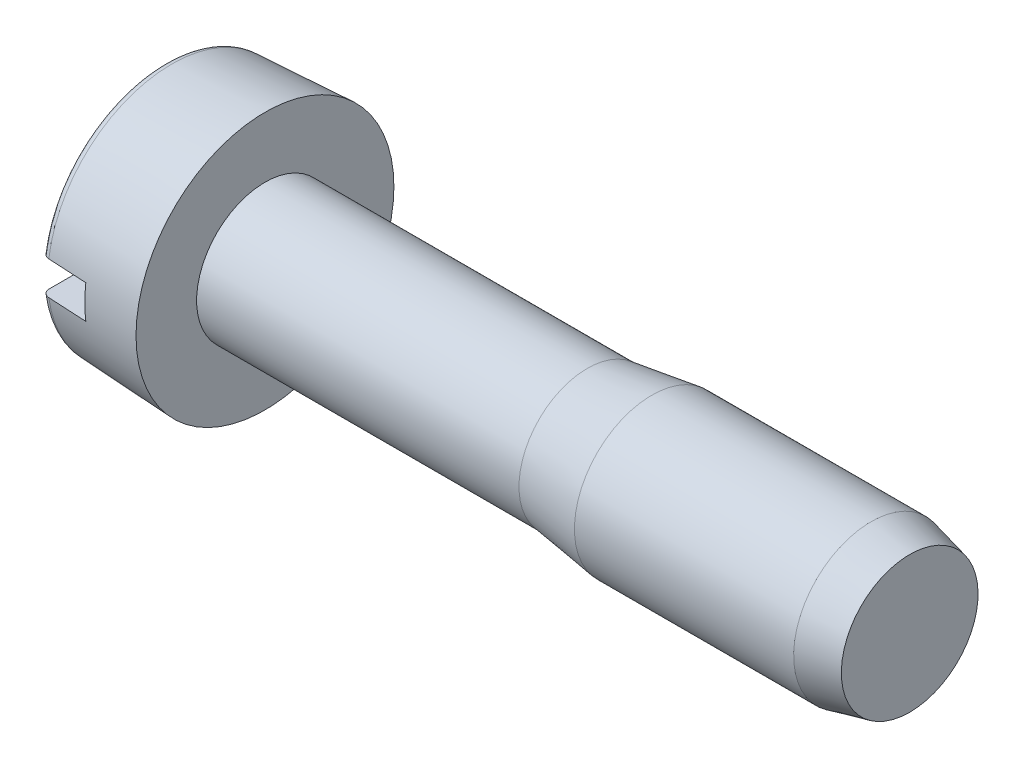
ISO-10303-21;
HEADER;
FILE_DESCRIPTION(('STEP AP214'),'2;1');
FILE_NAME('part.step','',(''),(''),'','','');
FILE_SCHEMA(('AUTOMOTIVE_DESIGN { 1 0 10303 214 1 1 1 1 }'));
ENDSEC;
DATA;
#1=APPLICATION_CONTEXT('core data for automotive mechanical design processes');
#2=APPLICATION_PROTOCOL_DEFINITION('international standard','automotive_design',2000,#1);
#3=PRODUCT_CONTEXT('',#1,'mechanical');
#4=PRODUCT('Part','Part','',(#3));
#5=PRODUCT_RELATED_PRODUCT_CATEGORY('part','',(#4));
#6=PRODUCT_DEFINITION_FORMATION('','',#4);
#7=PRODUCT_DEFINITION_CONTEXT('part definition',#1,'design');
#8=PRODUCT_DEFINITION('design','',#6,#7);
#9=PRODUCT_DEFINITION_SHAPE('','',#8);
#10=(LENGTH_UNIT() NAMED_UNIT(*) SI_UNIT(.MILLI.,.METRE.));
#11=(NAMED_UNIT(*) PLANE_ANGLE_UNIT() SI_UNIT($,.RADIAN.));
#12=(NAMED_UNIT(*) SI_UNIT($,.STERADIAN.) SOLID_ANGLE_UNIT());
#13=UNCERTAINTY_MEASURE_WITH_UNIT(LENGTH_MEASURE(1.E-05),#10,'distance_accuracy_value','');
#14=(GEOMETRIC_REPRESENTATION_CONTEXT(3) GLOBAL_UNCERTAINTY_ASSIGNED_CONTEXT((#13)) GLOBAL_UNIT_ASSIGNED_CONTEXT((#10,
#11,#12)) REPRESENTATION_CONTEXT('',''));
#15=CARTESIAN_POINT('',(0.,0.,0.));
#16=DIRECTION('',(0.,0.,1.));
#17=DIRECTION('',(1.,0.,0.));
#18=AXIS2_PLACEMENT_3D('',#15,#16,#17);
#19=CARTESIAN_POINT('',(-27.1,-3.1,0.6));
#20=DIRECTION('',(0.,1.,0.));
#21=DIRECTION('',(0.,0.,1.));
#22=AXIS2_PLACEMENT_3D('',#19,#20,#21);
#23=PLANE('',#22);
#24=DIRECTION('',(0.,0.,-1.));
#25=VECTOR('',#24,1.);
#26=CARTESIAN_POINT('',(-27.1,-3.1,-0.821756947872713));
#27=LINE('',#26,#25);
#28=CARTESIAN_POINT('',(-27.1,-3.1,0.6));
#29=VERTEX_POINT('',#28);
#30=CARTESIAN_POINT('',(-27.1,-3.1,-0.6));
#31=VERTEX_POINT('',#30);
#32=EDGE_CURVE('E168',#29,#31,#27,.T.);
#33=ORIENTED_EDGE('',*,*,#32,.T.);
#34=DIRECTION('',(1.,0.,0.));
#35=VECTOR('',#34,1.);
#36=CARTESIAN_POINT('',(-27.1,-3.1,-0.6));
#37=LINE('',#36,#35);
#38=CARTESIAN_POINT('',(-28.9,-3.1,-0.6));
#39=VERTEX_POINT('',#38);
#40=EDGE_CURVE('E167',#39,#31,#37,.T.);
#41=ORIENTED_EDGE('',*,*,#40,.F.);
#42=DIRECTION('',(0.,0.,1.));
#43=VECTOR('',#42,1.);
#44=CARTESIAN_POINT('',(-28.9,-3.1,0.6));
#45=LINE('',#44,#43);
#46=CARTESIAN_POINT('',(-28.9,-3.1,0.6));
#47=VERTEX_POINT('',#46);
#48=EDGE_CURVE('E177',#39,#47,#45,.T.);
#49=ORIENTED_EDGE('',*,*,#48,.T.);
#50=DIRECTION('',(1.,0.,0.));
#51=VECTOR('',#50,1.);
#52=CARTESIAN_POINT('',(-27.1,-3.1,0.6));
#53=LINE('',#52,#51);
#54=EDGE_CURVE('E207',#29,#47,#53,.F.);
#55=ORIENTED_EDGE('',*,*,#54,.F.);
#56=EDGE_LOOP('',(#33,#41,#49,#55));
#57=FACE_BOUND('',#56,.T.);
#58=ADVANCED_FACE('F17',(#57),#23,.T.);
#59=CARTESIAN_POINT('',(-27.1,-0.6,3.1));
#60=DIRECTION('',(0.,0.998329605681856,-0.0577754136212761));
#61=DIRECTION('',(0.,0.0577754136212761,0.998329605681856));
#62=AXIS2_PLACEMENT_3D('',#59,#60,#61);
#63=PLANE('',#62);
#64=DIRECTION('',(0.,-0.0577754136212742,-0.998329605681856));
#65=VECTOR('',#64,1.);
#66=CARTESIAN_POINT('',(-27.1,-0.65,2.23602556597347));
#67=LINE('',#66,#65);
#68=CARTESIAN_POINT('',(-27.1,-0.649999999999998,2.23602556597351));
#69=VERTEX_POINT('',#68);
#70=CARTESIAN_POINT('',(-27.1,-0.736765313499312,0.736765313499308));
#71=VERTEX_POINT('',#70);
#72=EDGE_CURVE('E186',#69,#71,#67,.T.);
#73=ORIENTED_EDGE('',*,*,#72,.T.);
#74=DIRECTION('',(1.,0.,0.));
#75=VECTOR('',#74,1.);
#76=CARTESIAN_POINT('',(-27.1,-0.736765313499312,0.736765313499308));
#77=LINE('',#76,#75);
#78=CARTESIAN_POINT('',(-28.9,-0.736765313499312,0.736765313499308));
#79=VERTEX_POINT('',#78);
#80=EDGE_CURVE('E196',#79,#71,#77,.T.);
#81=ORIENTED_EDGE('',*,*,#80,.F.);
#82=DIRECTION('',(0.,0.0577754136212761,0.998329605681856));
#83=VECTOR('',#82,1.);
#84=CARTESIAN_POINT('',(-28.9,-0.6,3.1));
#85=LINE('',#84,#83);
#86=CARTESIAN_POINT('',(-28.9,-0.65,2.23602556597344));
#87=VERTEX_POINT('',#86);
#88=EDGE_CURVE('E173',#79,#87,#85,.T.);
#89=ORIENTED_EDGE('',*,*,#88,.T.);
#90=DIRECTION('',(1.,0.,0.));
#91=VECTOR('',#90,1.);
#92=CARTESIAN_POINT('',(-27.1,-0.65,2.23602556597347));
#93=LINE('',#92,#91);
#94=EDGE_CURVE('E137',#69,#87,#93,.F.);
#95=ORIENTED_EDGE('',*,*,#94,.F.);
#96=EDGE_LOOP('',(#73,#81,#89,#95));
#97=FACE_BOUND('',#96,.T.);
#98=ADVANCED_FACE('F457',(#97),#63,.T.);
#99=CARTESIAN_POINT('',(-27.1,-0.6,-3.1));
#100=DIRECTION('',(0.,0.998329605681856,0.0577754136212757));
#101=DIRECTION('',(0.,-0.0577754136212757,0.998329605681856));
#102=AXIS2_PLACEMENT_3D('',#99,#100,#101);
#103=PLANE('',#102);
#104=DIRECTION('',(0.,-0.0577754136212757,0.998329605681856));
#105=VECTOR('',#104,1.);
#106=CARTESIAN_POINT('',(-28.9,-0.6,-3.1));
#107=LINE('',#106,#105);
#108=CARTESIAN_POINT('',(-28.9,-0.649999999999999,-2.23602556597346));
#109=VERTEX_POINT('',#108);
#110=CARTESIAN_POINT('',(-28.9,-0.736765313499312,-0.736765313499307));
#111=VERTEX_POINT('',#110);
#112=EDGE_CURVE('E171',#109,#111,#107,.T.);
#113=ORIENTED_EDGE('',*,*,#112,.T.);
#114=DIRECTION('',(1.,0.,0.));
#115=VECTOR('',#114,1.);
#116=CARTESIAN_POINT('',(-27.1,-0.736765313499312,-0.736765313499306));
#117=LINE('',#116,#115);
#118=CARTESIAN_POINT('',(-27.1,-0.736765313499312,-0.736765313499307));
#119=VERTEX_POINT('',#118);
#120=EDGE_CURVE('E193',#119,#111,#117,.F.);
#121=ORIENTED_EDGE('',*,*,#120,.F.);
#122=DIRECTION('',(0.,0.0577754136212742,-0.998329605681856));
#123=VECTOR('',#122,1.);
#124=CARTESIAN_POINT('',(-27.1,-0.736765313499312,-0.736765313499307));
#125=LINE('',#124,#123);
#126=CARTESIAN_POINT('',(-27.1,-0.65,-2.23602556597346));
#127=VERTEX_POINT('',#126);
#128=EDGE_CURVE('E165',#119,#127,#125,.T.);
#129=ORIENTED_EDGE('',*,*,#128,.T.);
#130=DIRECTION('',(1.,0.,0.));
#131=VECTOR('',#130,1.);
#132=CARTESIAN_POINT('',(-27.1,-0.649999999999999,-2.23602556597346));
#133=LINE('',#132,#131);
#134=EDGE_CURVE('E152',#109,#127,#133,.T.);
#135=ORIENTED_EDGE('',*,*,#134,.F.);
#136=EDGE_LOOP('',(#113,#121,#129,#135));
#137=FACE_BOUND('',#136,.T.);
#138=ADVANCED_FACE('F588',(#137),#103,.T.);
#139=CARTESIAN_POINT('',(-27.1,3.1,0.6));
#140=DIRECTION('',(0.,-1.,0.));
#141=DIRECTION('',(0.,0.,-1.));
#142=AXIS2_PLACEMENT_3D('',#139,#140,#141);
#143=PLANE('',#142);
#144=DIRECTION('',(0.,0.,-1.));
#145=VECTOR('',#144,1.);
#146=CARTESIAN_POINT('',(-27.1,3.1,-0.821756947872713));
#147=LINE('',#146,#145);
#148=CARTESIAN_POINT('',(-27.1,3.1,-0.6));
#149=VERTEX_POINT('',#148);
#150=CARTESIAN_POINT('',(-27.1,3.1,0.6));
#151=VERTEX_POINT('',#150);
#152=EDGE_CURVE('E390',#149,#151,#147,.F.);
#153=ORIENTED_EDGE('',*,*,#152,.T.);
#154=DIRECTION('',(1.,0.,0.));
#155=VECTOR('',#154,1.);
#156=CARTESIAN_POINT('',(-27.1,3.1,0.6));
#157=LINE('',#156,#155);
#158=CARTESIAN_POINT('',(-28.9,3.1,0.6));
#159=VERTEX_POINT('',#158);
#160=EDGE_CURVE('E153',#159,#151,#157,.T.);
#161=ORIENTED_EDGE('',*,*,#160,.F.);
#162=DIRECTION('',(0.,0.,-1.));
#163=VECTOR('',#162,1.);
#164=CARTESIAN_POINT('',(-28.9,3.1,0.6));
#165=LINE('',#164,#163);
#166=CARTESIAN_POINT('',(-28.9,3.1,-0.6));
#167=VERTEX_POINT('',#166);
#168=EDGE_CURVE('E161',#159,#167,#165,.T.);
#169=ORIENTED_EDGE('',*,*,#168,.T.);
#170=DIRECTION('',(1.,0.,0.));
#171=VECTOR('',#170,1.);
#172=CARTESIAN_POINT('',(-27.1,3.1,-0.6));
#173=LINE('',#172,#171);
#174=EDGE_CURVE('E227',#149,#167,#173,.F.);
#175=ORIENTED_EDGE('',*,*,#174,.F.);
#176=EDGE_LOOP('',(#153,#161,#169,#175));
#177=FACE_BOUND('',#176,.T.);
#178=ADVANCED_FACE('F586',(#177),#143,.T.);
#179=CARTESIAN_POINT('',(-27.1,0.6,-3.1));
#180=DIRECTION('',(0.,-0.998329605681856,0.0577754136212758));
#181=DIRECTION('',(0.,-0.0577754136212758,-0.998329605681856));
#182=AXIS2_PLACEMENT_3D('',#179,#180,#181);
#183=PLANE('',#182);
#184=DIRECTION('',(0.,0.0577754136212756,0.998329605681856));
#185=VECTOR('',#184,1.);
#186=CARTESIAN_POINT('',(-27.1,0.65,-2.23602556597345));
#187=LINE('',#186,#185);
#188=CARTESIAN_POINT('',(-27.1,0.650000000000002,-2.23602556597343));
#189=VERTEX_POINT('',#188);
#190=CARTESIAN_POINT('',(-27.1,0.736765313499313,-0.736765313499307));
#191=VERTEX_POINT('',#190);
#192=EDGE_CURVE('E147',#189,#191,#187,.T.);
#193=ORIENTED_EDGE('',*,*,#192,.T.);
#194=DIRECTION('',(1.,0.,0.));
#195=VECTOR('',#194,1.);
#196=CARTESIAN_POINT('',(-27.1,0.736765313499312,-0.736765313499306));
#197=LINE('',#196,#195);
#198=CARTESIAN_POINT('',(-28.9,0.736765313499312,-0.736765313499307));
#199=VERTEX_POINT('',#198);
#200=EDGE_CURVE('E217',#199,#191,#197,.T.);
#201=ORIENTED_EDGE('',*,*,#200,.F.);
#202=DIRECTION('',(0.,-0.0577754136212758,-0.998329605681856));
#203=VECTOR('',#202,1.);
#204=CARTESIAN_POINT('',(-28.9,0.6,-3.1));
#205=LINE('',#204,#203);
#206=CARTESIAN_POINT('',(-28.9,0.650000000000001,-2.23602556597343));
#207=VERTEX_POINT('',#206);
#208=EDGE_CURVE('E402',#199,#207,#205,.T.);
#209=ORIENTED_EDGE('',*,*,#208,.T.);
#210=DIRECTION('',(1.,0.,0.));
#211=VECTOR('',#210,1.);
#212=CARTESIAN_POINT('',(-27.1,0.650000000000001,-2.23602556597345));
#213=LINE('',#212,#211);
#214=EDGE_CURVE('E370',#189,#207,#213,.F.);
#215=ORIENTED_EDGE('',*,*,#214,.F.);
#216=EDGE_LOOP('',(#193,#201,#209,#215));
#217=FACE_BOUND('',#216,.T.);
#218=ADVANCED_FACE('F417',(#217),#183,.T.);
#219=CARTESIAN_POINT('',(-27.1,0.6,3.1));
#220=DIRECTION('',(0.,-0.998329605681856,-0.0577754136212763));
#221=DIRECTION('',(0.,0.0577754136212763,-0.998329605681856));
#222=AXIS2_PLACEMENT_3D('',#219,#220,#221);
#223=PLANE('',#222);
#224=DIRECTION('',(0.,0.0577754136212763,-0.998329605681856));
#225=VECTOR('',#224,1.);
#226=CARTESIAN_POINT('',(-28.9,0.6,3.1));
#227=LINE('',#226,#225);
#228=CARTESIAN_POINT('',(-28.9,0.650000000000001,2.23602556597341));
#229=VERTEX_POINT('',#228);
#230=CARTESIAN_POINT('',(-28.9,0.736765313499313,0.736765313499306));
#231=VERTEX_POINT('',#230);
#232=EDGE_CURVE('E148',#229,#231,#227,.T.);
#233=ORIENTED_EDGE('',*,*,#232,.T.);
#234=DIRECTION('',(1.,0.,0.));
#235=VECTOR('',#234,1.);
#236=CARTESIAN_POINT('',(-27.1,0.736765313499312,0.736765313499306));
#237=LINE('',#236,#235);
#238=CARTESIAN_POINT('',(-27.1,0.736765313499313,0.736765313499307));
#239=VERTEX_POINT('',#238);
#240=EDGE_CURVE('E214',#239,#231,#237,.F.);
#241=ORIENTED_EDGE('',*,*,#240,.F.);
#242=DIRECTION('',(0.,-0.0577754136212775,0.998329605681856));
#243=VECTOR('',#242,1.);
#244=CARTESIAN_POINT('',(-27.1,0.736765313499313,0.736765313499307));
#245=LINE('',#244,#243);
#246=CARTESIAN_POINT('',(-27.1,0.65,2.23602556597342));
#247=VERTEX_POINT('',#246);
#248=EDGE_CURVE('E393',#239,#247,#245,.T.);
#249=ORIENTED_EDGE('',*,*,#248,.T.);
#250=DIRECTION('',(1.,0.,0.));
#251=VECTOR('',#250,1.);
#252=CARTESIAN_POINT('',(-27.1,0.65,2.23602556597342));
#253=LINE('',#252,#251);
#254=EDGE_CURVE('E271',#229,#247,#253,.T.);
#255=ORIENTED_EDGE('',*,*,#254,.F.);
#256=EDGE_LOOP('',(#233,#241,#249,#255));
#257=FACE_BOUND('',#256,.T.);
#258=ADVANCED_FACE('F585',(#257),#223,.T.);
#259=CARTESIAN_POINT('',(-27.1,0.731846670595882,-0.821756947872713));
#260=DIRECTION('',(1.,0.,0.));
#261=DIRECTION('',(0.,0.,-1.));
#262=AXIS2_PLACEMENT_3D('',#259,#260,#261);
#263=PLANE('',#262);
#264=ORIENTED_EDGE('',*,*,#128,.F.);
#265=DIRECTION('',(0.,-0.998329605681856,0.0577754136212735));
#266=VECTOR('',#265,1.);
#267=CARTESIAN_POINT('',(-27.1,-3.1,-0.6));
#268=LINE('',#267,#266);
#269=EDGE_CURVE('E197',#31,#119,#268,.F.);
#270=ORIENTED_EDGE('',*,*,#269,.F.);
#271=ORIENTED_EDGE('',*,*,#32,.F.);
#272=DIRECTION('',(0.,0.998329605681856,0.0577754136212742));
#273=VECTOR('',#272,1.);
#274=CARTESIAN_POINT('',(-27.1,-3.1,0.6));
#275=LINE('',#274,#273);
#276=EDGE_CURVE('E204',#71,#29,#275,.F.);
#277=ORIENTED_EDGE('',*,*,#276,.F.);
#278=ORIENTED_EDGE('',*,*,#72,.F.);
#279=DIRECTION('',(0.,0.,1.));
#280=VECTOR('',#279,1.);
#281=CARTESIAN_POINT('',(-27.1,-0.65,6.));
#282=LINE('',#281,#280);
#283=CARTESIAN_POINT('',(-27.1000000000093,-0.65,4.84655021971619));
#284=VERTEX_POINT('',#283);
#285=EDGE_CURVE('E180',#284,#69,#282,.F.);
#286=ORIENTED_EDGE('',*,*,#285,.F.);
#287=CARTESIAN_POINT('',(-27.1000000000186,0.,0.));
#288=DIRECTION('',(1.,0.,0.));
#289=DIRECTION('',(0.,0.,-1.));
#290=AXIS2_PLACEMENT_3D('',#287,#288,#289);
#291=CIRCLE('',#290,4.8899436635023);
#292=CARTESIAN_POINT('',(-27.1000000000111,0.65,4.84655021971609));
#293=VERTEX_POINT('',#292);
#294=EDGE_CURVE('E188',#293,#284,#291,.T.);
#295=ORIENTED_EDGE('',*,*,#294,.F.);
#296=DIRECTION('',(0.,0.,-1.));
#297=VECTOR('',#296,1.);
#298=CARTESIAN_POINT('',(-27.1,0.65,6.));
#299=LINE('',#298,#297);
#300=EDGE_CURVE('E250',#247,#293,#299,.F.);
#301=ORIENTED_EDGE('',*,*,#300,.F.);
#302=ORIENTED_EDGE('',*,*,#248,.F.);
#303=DIRECTION('',(0.,0.998329605681856,-0.0577754136212734));
#304=VECTOR('',#303,1.);
#305=CARTESIAN_POINT('',(-27.1,3.1,0.6));
#306=LINE('',#305,#304);
#307=EDGE_CURVE('E156',#151,#239,#306,.F.);
#308=ORIENTED_EDGE('',*,*,#307,.F.);
#309=ORIENTED_EDGE('',*,*,#152,.F.);
#310=DIRECTION('',(0.,-0.998329605681856,-0.0577754136212735));
#311=VECTOR('',#310,1.);
#312=CARTESIAN_POINT('',(-27.1,3.1,-0.6));
#313=LINE('',#312,#311);
#314=EDGE_CURVE('E224',#191,#149,#313,.F.);
#315=ORIENTED_EDGE('',*,*,#314,.F.);
#316=ORIENTED_EDGE('',*,*,#192,.F.);
#317=DIRECTION('',(0.,0.,-1.));
#318=VECTOR('',#317,1.);
#319=CARTESIAN_POINT('',(-27.1,0.65,6.));
#320=LINE('',#319,#318);
#321=CARTESIAN_POINT('',(-27.1000000000093,0.650000000000001,-4.84655021971619));
#322=VERTEX_POINT('',#321);
#323=EDGE_CURVE('E145',#322,#189,#320,.F.);
#324=ORIENTED_EDGE('',*,*,#323,.F.);
#325=CARTESIAN_POINT('',(-27.1000000000186,0.,0.));
#326=DIRECTION('',(1.,0.,0.));
#327=DIRECTION('',(0.,0.,-1.));
#328=AXIS2_PLACEMENT_3D('',#325,#326,#327);
#329=CIRCLE('',#328,4.8899436635023);
#330=CARTESIAN_POINT('',(-27.1000000000111,-0.649999999999999,-4.84655021971609));
#331=VERTEX_POINT('',#330);
#332=EDGE_CURVE('E20',#331,#322,#329,.T.);
#333=ORIENTED_EDGE('',*,*,#332,.F.);
#334=DIRECTION('',(0.,0.,1.));
#335=VECTOR('',#334,1.);
#336=CARTESIAN_POINT('',(-27.1,-0.65,6.));
#337=LINE('',#336,#335);
#338=EDGE_CURVE('E142',#127,#331,#337,.F.);
#339=ORIENTED_EDGE('',*,*,#338,.F.);
#340=EDGE_LOOP('',(#264,#270,#271,#277,#278,#286,#295,#301,#302,#308,#309,#315,#316,#324,#333,#339));
#341=FACE_BOUND('',#340,.T.);
#342=ADVANCED_FACE('F141',(#341),#263,.F.);
#343=CARTESIAN_POINT('',(-27.1,-3.1,-0.6));
#344=DIRECTION('',(0.,0.0577754136212735,0.998329605681856));
#345=DIRECTION('',(0.,-0.998329605681856,0.0577754136212735));
#346=AXIS2_PLACEMENT_3D('',#343,#344,#345);
#347=PLANE('',#346);
#348=ORIENTED_EDGE('',*,*,#269,.T.);
#349=ORIENTED_EDGE('',*,*,#120,.T.);
#350=DIRECTION('',(0.,-0.998329605681856,0.0577754136212738));
#351=VECTOR('',#350,1.);
#352=CARTESIAN_POINT('',(-28.9,-0.736765313499314,-0.736765313499307));
#353=LINE('',#352,#351);
#354=EDGE_CURVE('E246',#111,#39,#353,.T.);
#355=ORIENTED_EDGE('',*,*,#354,.T.);
#356=ORIENTED_EDGE('',*,*,#40,.T.);
#357=EDGE_LOOP('',(#348,#349,#355,#356));
#358=FACE_BOUND('',#357,.T.);
#359=ADVANCED_FACE('F445',(#358),#347,.T.);
#360=CARTESIAN_POINT('',(-27.1,-3.1,0.6));
#361=DIRECTION('',(0.,0.0577754136212742,-0.998329605681856));
#362=DIRECTION('',(0.,0.998329605681856,0.0577754136212742));
#363=AXIS2_PLACEMENT_3D('',#360,#361,#362);
#364=PLANE('',#363);
#365=ORIENTED_EDGE('',*,*,#276,.T.);
#366=ORIENTED_EDGE('',*,*,#54,.T.);
#367=DIRECTION('',(0.,0.998329605681856,0.0577754136212738));
#368=VECTOR('',#367,1.);
#369=CARTESIAN_POINT('',(-28.9,-3.1,0.6));
#370=LINE('',#369,#368);
#371=EDGE_CURVE('E249',#47,#79,#370,.T.);
#372=ORIENTED_EDGE('',*,*,#371,.T.);
#373=ORIENTED_EDGE('',*,*,#80,.T.);
#374=EDGE_LOOP('',(#365,#366,#372,#373));
#375=FACE_BOUND('',#374,.T.);
#376=ADVANCED_FACE('F450',(#375),#364,.T.);
#377=CARTESIAN_POINT('',(-27.1,-0.65,6.));
#378=DIRECTION('',(0.,1.,0.));
#379=DIRECTION('',(0.,0.,1.));
#380=AXIS2_PLACEMENT_3D('',#377,#378,#379);
#381=PLANE('',#380);
#382=ORIENTED_EDGE('',*,*,#285,.T.);
#383=ORIENTED_EDGE('',*,*,#94,.T.);
#384=DIRECTION('',(0.,0.,-1.));
#385=VECTOR('',#384,1.);
#386=CARTESIAN_POINT('',(-28.9,-0.65,0.));
#387=LINE('',#386,#385);
#388=CARTESIAN_POINT('',(-28.9,-0.649999999999999,4.46384384469103));
#389=VERTEX_POINT('',#388);
#390=EDGE_CURVE('E255',#87,#389,#387,.F.);
#391=ORIENTED_EDGE('',*,*,#390,.T.);
#392=CARTESIAN_POINT('',(-28.9,-0.65,4.46384384469103));
#393=CARTESIAN_POINT('',(-28.9000138300466,-0.650000000000852,4.48101548007226));
#394=CARTESIAN_POINT('',(-28.8985570770058,-0.650000000000504,4.49818417304899));
#395=CARTESIAN_POINT('',(-28.8928006492324,-0.649999999999496,4.53203095409328));
#396=CARTESIAN_POINT('',(-28.8885022034223,-0.649999999998838,4.54870925098313));
#397=CARTESIAN_POINT('',(-28.8771569966185,-0.649999999999295,4.58111613257452));
#398=CARTESIAN_POINT('',(-28.8701085498493,-0.650000000000412,4.59684412788974));
#399=CARTESIAN_POINT('',(-28.8534604230999,-0.649999999999588,4.62688063174059));
#400=CARTESIAN_POINT('',(-28.8438615329724,-0.649999999997648,4.64118957786406));
#401=CARTESIAN_POINT('',(-28.8224303858488,-0.649999999998036,4.66790471961695));
#402=CARTESIAN_POINT('',(-28.8106097051928,-0.650000000000342,4.68032019923142));
#403=CARTESIAN_POINT('',(-28.7850342675739,-0.649999999999658,4.70296657186775));
#404=CARTESIAN_POINT('',(-28.771279718352,-0.649999999996668,4.71319769924116));
#405=CARTESIAN_POINT('',(-28.7423602564357,-0.649999999997029,4.73108842708656));
#406=CARTESIAN_POINT('',(-28.7272089024378,-0.650000000000325,4.73876998379459));
#407=CARTESIAN_POINT('',(-28.6958316911661,-0.649999999999676,4.75144886879571));
#408=CARTESIAN_POINT('',(-28.6796070831197,-0.64999999999574,4.7564492581932));
#409=CARTESIAN_POINT('',(-28.6552877662473,-0.649999999997301,4.76173091349423));
#410=CARTESIAN_POINT('',(-28.647417452348,-0.649999999998918,4.76311023140138));
#411=CARTESIAN_POINT('',(-28.6316051948906,-0.65000000000108,4.76522985828111));
#412=CARTESIAN_POINT('',(-28.6236634000131,-0.650000000001628,4.76597127634225));
#413=CARTESIAN_POINT('',(-28.6157007868728,-0.650000000000001,4.766392587047));
#414=B_SPLINE_CURVE_WITH_KNOTS('',3,(#392,#393,#394,#395,#396,#397,#398,#399,#400,#401,#402,
#403,#404,#405,#406,#407,#408,#409,#410,#411,#412,#413),.UNSPECIFIED.,.F.,.F.,(4,2,2,2,2,2,2,2,
2,2,4),(0.,0.0514492128967299,0.102876190533917,0.154334743030387,0.205777377746456,
0.256959056350629,0.308135241087921,0.358858526215049,0.409523776291095,0.433472591586532,
0.457379683490669),.UNSPECIFIED.);
#415=CARTESIAN_POINT('',(-28.6157007868725,-0.65,4.76639258704452));
#416=VERTEX_POINT('',#415);
#417=EDGE_CURVE('E385',#389,#416,#414,.T.);
#418=ORIENTED_EDGE('',*,*,#417,.T.);
#419=CARTESIAN_POINT('',(-28.6157007868727,-0.65,4.76639258704451));
#420=CARTESIAN_POINT('',(-28.3630840945807,-0.65,4.77975418775871));
#421=CARTESIAN_POINT('',(-28.1104673495289,-0.65,4.79311479083847));
#422=CARTESIAN_POINT('',(-27.6052337539059,-0.65,4.81983400172913));
#423=CARTESIAN_POINT('',(-27.3526169033346,-0.65,4.83319260954003));
#424=CARTESIAN_POINT('',(-27.1000000000036,-0.65,4.84655021971649));
#425=B_SPLINE_CURVE_WITH_KNOTS('',3,(#419,#420,#421,#422,#423,#424),.UNSPECIFIED.,.F.,.F.,(4,2,
4),(0.,0.758909434884631,1.51781886976906),.UNSPECIFIED.);
#426=EDGE_CURVE('E183',#416,#284,#425,.T.);
#427=ORIENTED_EDGE('',*,*,#426,.T.);
#428=EDGE_LOOP('',(#382,#383,#391,#418,#427));
#429=FACE_BOUND('',#428,.T.);
#430=ADVANCED_FACE('F460',(#429),#381,.T.);
#431=CARTESIAN_POINT('',(-27.1,-0.65,6.));
#432=DIRECTION('',(0.,1.,0.));
#433=DIRECTION('',(0.,0.,1.));
#434=AXIS2_PLACEMENT_3D('',#431,#432,#433);
#435=PLANE('',#434);
#436=ORIENTED_EDGE('',*,*,#134,.T.);
#437=ORIENTED_EDGE('',*,*,#338,.T.);
#438=CARTESIAN_POINT('',(-27.1000000000036,-0.649999999999999,-4.84655021971649));
#439=CARTESIAN_POINT('',(-27.3526169033346,-0.649999999999999,-4.83319260954003));
#440=CARTESIAN_POINT('',(-27.6052337539059,-0.649999999999999,-4.81983400172913));
#441=CARTESIAN_POINT('',(-28.1104673495289,-0.649999999999999,-4.79311479083847));
#442=CARTESIAN_POINT('',(-28.3630840945807,-0.649999999999999,-4.77975418775871));
#443=CARTESIAN_POINT('',(-28.6157007868727,-0.649999999999999,-4.76639258704451));
#444=B_SPLINE_CURVE_WITH_KNOTS('',3,(#438,#439,#440,#441,#442,#443),.UNSPECIFIED.,.F.,.F.,(4,2,
4),(0.,0.758909434884433,1.51781886976906),.UNSPECIFIED.);
#445=CARTESIAN_POINT('',(-28.6157007868726,-0.649999999999998,-4.76639258704576));
#446=VERTEX_POINT('',#445);
#447=EDGE_CURVE('E126',#331,#446,#444,.T.);
#448=ORIENTED_EDGE('',*,*,#447,.T.);
#449=CARTESIAN_POINT('',(-28.6157007868728,-0.649999999999998,-4.766392587047));
#450=CARTESIAN_POINT('',(-28.6324537475921,-0.649999999999996,-4.76552141775175));
#451=CARTESIAN_POINT('',(-28.6491248050134,-0.649999999999997,-4.76320361991946));
#452=CARTESIAN_POINT('',(-28.68182717852,-0.65,-4.75581267700588));
#453=CARTESIAN_POINT('',(-28.6978591400304,-0.650000000000002,-4.75074239144344));
#454=CARTESIAN_POINT('',(-28.7288499083937,-0.650000000000003,-4.73797959710168));
#455=CARTESIAN_POINT('',(-28.7438083058033,-0.650000000000001,-4.73028609422774));
#456=CARTESIAN_POINT('',(-28.7722267720699,-0.649999999999996,-4.71250972359004));
#457=CARTESIAN_POINT('',(-28.7856870346416,-0.649999999999992,-4.70242716526927));
#458=CARTESIAN_POINT('',(-28.8107980489182,-0.650000000000002,-4.68011340750307));
#459=CARTESIAN_POINT('',(-28.8224404343177,-0.650000000000017,-4.66787279565758));
#460=CARTESIAN_POINT('',(-28.8435273038957,-0.64999999999998,-4.64162536194168));
#461=CARTESIAN_POINT('',(-28.8529716696898,-0.649999999999928,-4.6276184450014));
#462=CARTESIAN_POINT('',(-28.8694891822947,-0.650000000000073,-4.59809693785163));
#463=CARTESIAN_POINT('',(-28.8765389467002,-0.650000000000272,-4.58256928718082));
#464=CARTESIAN_POINT('',(-28.8879514025919,-0.649999999999725,-4.5505635339102));
#465=CARTESIAN_POINT('',(-28.892316364617,-0.64999999999898,-4.53408624735345));
#466=CARTESIAN_POINT('',(-28.8968552064179,-0.649999999999336,-4.50853577756022));
#467=CARTESIAN_POINT('',(-28.8980347526549,-0.649999999999733,-4.4996300143795));
#468=CARTESIAN_POINT('',(-28.8996064620039,-0.650000000000264,-4.48176540638319));
#469=CARTESIAN_POINT('',(-28.9000000374853,-0.650000000000398,-4.47280668584981));
#470=CARTESIAN_POINT('',(-28.9,-0.649999999999997,-4.46384384469103));
#471=B_SPLINE_CURVE_WITH_KNOTS('',3,(#449,#450,#451,#452,#453,#454,#455,#456,#457,#458,#459,
#460,#461,#462,#463,#464,#465,#466,#467,#468,#469,#470),.UNSPECIFIED.,.F.,.F.,(4,2,2,2,2,2,2,2,
2,2,4),(0.,0.0502577092805203,0.100463306209571,0.150687950240002,0.200906092464167,
0.251348939907642,0.301794503554127,0.352719368702959,0.403601107237235,0.43052121437475,
0.457392903081884),.UNSPECIFIED.);
#472=CARTESIAN_POINT('',(-28.9,-0.650000000000001,-4.46384384469103));
#473=VERTEX_POINT('',#472);
#474=EDGE_CURVE('E136',#446,#473,#471,.T.);
#475=ORIENTED_EDGE('',*,*,#474,.T.);
#476=DIRECTION('',(0.,0.,-1.));
#477=VECTOR('',#476,1.);
#478=CARTESIAN_POINT('',(-28.9,-0.65,0.));
#479=LINE('',#478,#477);
#480=EDGE_CURVE('E238',#473,#109,#479,.F.);
#481=ORIENTED_EDGE('',*,*,#480,.T.);
#482=EDGE_LOOP('',(#436,#437,#448,#475,#481));
#483=FACE_BOUND('',#482,.T.);
#484=ADVANCED_FACE('F149',(#483),#435,.T.);
#485=CARTESIAN_POINT('',(-27.1,3.1,0.6));
#486=DIRECTION('',(0.,-0.0577754136212734,-0.998329605681856));
#487=DIRECTION('',(0.,0.998329605681856,-0.0577754136212734));
#488=AXIS2_PLACEMENT_3D('',#485,#486,#487);
#489=PLANE('',#488);
#490=ORIENTED_EDGE('',*,*,#307,.T.);
#491=ORIENTED_EDGE('',*,*,#240,.T.);
#492=DIRECTION('',(0.,0.998329605681856,-0.0577754136212738));
#493=VECTOR('',#492,1.);
#494=CARTESIAN_POINT('',(-28.9,0.736765313499313,0.736765313499307));
#495=LINE('',#494,#493);
#496=EDGE_CURVE('E234',#231,#159,#495,.T.);
#497=ORIENTED_EDGE('',*,*,#496,.T.);
#498=ORIENTED_EDGE('',*,*,#160,.T.);
#499=EDGE_LOOP('',(#490,#491,#497,#498));
#500=FACE_BOUND('',#499,.T.);
#501=ADVANCED_FACE('F507',(#500),#489,.T.);
#502=CARTESIAN_POINT('',(-27.1,3.1,-0.6));
#503=DIRECTION('',(0.,-0.0577754136212735,0.998329605681856));
#504=DIRECTION('',(0.,-0.998329605681856,-0.0577754136212735));
#505=AXIS2_PLACEMENT_3D('',#502,#503,#504);
#506=PLANE('',#505);
#507=ORIENTED_EDGE('',*,*,#314,.T.);
#508=ORIENTED_EDGE('',*,*,#174,.T.);
#509=DIRECTION('',(0.,-0.998329605681856,-0.0577754136212738));
#510=VECTOR('',#509,1.);
#511=CARTESIAN_POINT('',(-28.9,3.1,-0.6));
#512=LINE('',#511,#510);
#513=EDGE_CURVE('E237',#167,#199,#512,.T.);
#514=ORIENTED_EDGE('',*,*,#513,.T.);
#515=ORIENTED_EDGE('',*,*,#200,.T.);
#516=EDGE_LOOP('',(#507,#508,#514,#515));
#517=FACE_BOUND('',#516,.T.);
#518=ADVANCED_FACE('F422',(#517),#506,.T.);
#519=CARTESIAN_POINT('',(-27.1,0.65,6.));
#520=DIRECTION('',(0.,-1.,0.));
#521=DIRECTION('',(0.,0.,-1.));
#522=AXIS2_PLACEMENT_3D('',#519,#520,#521);
#523=PLANE('',#522);
#524=ORIENTED_EDGE('',*,*,#323,.T.);
#525=ORIENTED_EDGE('',*,*,#214,.T.);
#526=DIRECTION('',(0.,0.,-1.));
#527=VECTOR('',#526,1.);
#528=CARTESIAN_POINT('',(-28.9,0.65,0.));
#529=LINE('',#528,#527);
#530=CARTESIAN_POINT('',(-28.9,0.650000000000001,-4.46384384469103));
#531=VERTEX_POINT('',#530);
#532=EDGE_CURVE('E243',#207,#531,#529,.T.);
#533=ORIENTED_EDGE('',*,*,#532,.T.);
#534=CARTESIAN_POINT('',(-28.9,0.650000000000001,-4.46384384469103));
#535=CARTESIAN_POINT('',(-28.9000138300466,0.650000000000854,-4.48101548007226));
#536=CARTESIAN_POINT('',(-28.8985570770058,0.650000000000506,-4.49818417304899));
#537=CARTESIAN_POINT('',(-28.8928006492324,0.649999999999497,-4.53203095409328));
#538=CARTESIAN_POINT('',(-28.8885022034223,0.649999999998837,-4.54870925098313));
#539=CARTESIAN_POINT('',(-28.8771569966185,0.649999999999295,-4.58111613257452));
#540=CARTESIAN_POINT('',(-28.8701085498493,0.650000000000413,-4.59684412788974));
#541=CARTESIAN_POINT('',(-28.8534604230999,0.64999999999959,-4.62688063174059));
#542=CARTESIAN_POINT('',(-28.8438615329724,0.64999999999765,-4.64118957786406));
#543=CARTESIAN_POINT('',(-28.8224303858488,0.649999999998037,-4.66790471961694));
#544=CARTESIAN_POINT('',(-28.8106097051928,0.650000000000343,-4.68032019923142));
#545=CARTESIAN_POINT('',(-28.7850342675739,0.64999999999966,-4.70296657186774));
#546=CARTESIAN_POINT('',(-28.771279718352,0.649999999996671,-4.71319769924116));
#547=CARTESIAN_POINT('',(-28.7423602564357,0.649999999997032,-4.73108842708656));
#548=CARTESIAN_POINT('',(-28.7272089024378,0.650000000000326,-4.73876998379459));
#549=CARTESIAN_POINT('',(-28.6958316911661,0.649999999999677,-4.75144886879571));
#550=CARTESIAN_POINT('',(-28.6796070831197,0.649999999995742,-4.7564492581932));
#551=CARTESIAN_POINT('',(-28.6552877662472,0.649999999997303,-4.76173091349423));
#552=CARTESIAN_POINT('',(-28.647417452348,0.649999999998919,-4.76311023140138));
#553=CARTESIAN_POINT('',(-28.6316051948906,0.650000000001082,-4.76522985828111));
#554=CARTESIAN_POINT('',(-28.6236634000131,0.650000000001629,-4.76597127634225));
#555=CARTESIAN_POINT('',(-28.6157007868728,0.650000000000001,-4.766392587047));
#556=B_SPLINE_CURVE_WITH_KNOTS('',3,(#534,#535,#536,#537,#538,#539,#540,#541,#542,#543,#544,
#545,#546,#547,#548,#549,#550,#551,#552,#553,#554,#555),.UNSPECIFIED.,.F.,.F.,(4,2,2,2,2,2,2,2,
2,2,4),(0.,0.0514492128967308,0.102876190533918,0.154334743030387,0.205777377746453,
0.256959056350626,0.30813524108792,0.358858526215052,0.409523776291097,0.433472591586531,
0.457379683490667),.UNSPECIFIED.);
#557=CARTESIAN_POINT('',(-28.6157007868725,0.650000000000001,-4.76639258704452));
#558=VERTEX_POINT('',#557);
#559=EDGE_CURVE('E35',#531,#558,#556,.T.);
#560=ORIENTED_EDGE('',*,*,#559,.T.);
#561=CARTESIAN_POINT('',(-28.6157007868727,0.650000000000001,-4.76639258704451));
#562=CARTESIAN_POINT('',(-28.3630840945807,0.650000000000001,-4.77975418775871));
#563=CARTESIAN_POINT('',(-28.1104673495289,0.650000000000001,-4.79311479083847));
#564=CARTESIAN_POINT('',(-27.6052337539059,0.650000000000001,-4.81983400172913));
#565=CARTESIAN_POINT('',(-27.3526169033346,0.650000000000001,-4.83319260954003));
#566=CARTESIAN_POINT('',(-27.1000000000036,0.650000000000001,-4.84655021971649));
#567=B_SPLINE_CURVE_WITH_KNOTS('',3,(#561,#562,#563,#564,#565,#566),.UNSPECIFIED.,.F.,.F.,(4,2,
4),(0.,0.758909434884631,1.51781886976906),.UNSPECIFIED.);
#568=EDGE_CURVE('E409',#558,#322,#567,.T.);
#569=ORIENTED_EDGE('',*,*,#568,.T.);
#570=EDGE_LOOP('',(#524,#525,#533,#560,#569));
#571=FACE_BOUND('',#570,.T.);
#572=ADVANCED_FACE('F489',(#571),#523,.T.);
#573=CARTESIAN_POINT('',(-27.1,0.65,6.));
#574=DIRECTION('',(0.,-1.,0.));
#575=DIRECTION('',(0.,0.,-1.));
#576=AXIS2_PLACEMENT_3D('',#573,#574,#575);
#577=PLANE('',#576);
#578=ORIENTED_EDGE('',*,*,#254,.T.);
#579=ORIENTED_EDGE('',*,*,#300,.T.);
#580=CARTESIAN_POINT('',(-27.1000000000036,0.65,4.84655021971649));
#581=CARTESIAN_POINT('',(-27.3526169033346,0.65,4.83319260954003));
#582=CARTESIAN_POINT('',(-27.6052337539059,0.65,4.81983400172913));
#583=CARTESIAN_POINT('',(-28.1104673495289,0.65,4.79311479083847));
#584=CARTESIAN_POINT('',(-28.3630840945807,0.65,4.77975418775871));
#585=CARTESIAN_POINT('',(-28.6157007868727,0.65,4.76639258704451));
#586=B_SPLINE_CURVE_WITH_KNOTS('',3,(#580,#581,#582,#583,#584,#585),.UNSPECIFIED.,.F.,.F.,(4,2,
4),(0.,0.758909434884433,1.51781886976906),.UNSPECIFIED.);
#587=CARTESIAN_POINT('',(-28.6157007868726,0.65,4.76639258704576));
#588=VERTEX_POINT('',#587);
#589=EDGE_CURVE('E272',#293,#588,#586,.T.);
#590=ORIENTED_EDGE('',*,*,#589,.T.);
#591=CARTESIAN_POINT('',(-28.6157007868728,0.649999999999999,4.766392587047));
#592=CARTESIAN_POINT('',(-28.6324537475921,0.65,4.76552141775176));
#593=CARTESIAN_POINT('',(-28.6491248050134,0.65,4.76320361991946));
#594=CARTESIAN_POINT('',(-28.6818271785199,0.65,4.75581267700588));
#595=CARTESIAN_POINT('',(-28.6978591400304,0.65,4.75074239144345));
#596=CARTESIAN_POINT('',(-28.7288499083937,0.650000000000001,4.73797959710168));
#597=CARTESIAN_POINT('',(-28.7438083058033,0.650000000000002,4.73028609422774));
#598=CARTESIAN_POINT('',(-28.7722267720699,0.649999999999999,4.71250972359005));
#599=CARTESIAN_POINT('',(-28.7856870346416,0.649999999999995,4.70242716526927));
#600=CARTESIAN_POINT('',(-28.8107980489182,0.650000000000005,4.68011340750308));
#601=CARTESIAN_POINT('',(-28.8224404343177,0.65000000000002,4.66787279565758));
#602=CARTESIAN_POINT('',(-28.8435273038957,0.649999999999981,4.64162536194168));
#603=CARTESIAN_POINT('',(-28.8529716696898,0.649999999999926,4.62761844500141));
#604=CARTESIAN_POINT('',(-28.8694891822947,0.650000000000072,4.59809693785163));
#605=CARTESIAN_POINT('',(-28.8765389467002,0.650000000000274,4.58256928718083));
#606=CARTESIAN_POINT('',(-28.8879514025919,0.649999999999727,4.55056353391021));
#607=CARTESIAN_POINT('',(-28.892316364617,0.649999999998979,4.53408624735346));
#608=CARTESIAN_POINT('',(-28.8968552064179,0.649999999999336,4.50853577756023));
#609=CARTESIAN_POINT('',(-28.8980347526549,0.649999999999734,4.4996300143795));
#610=CARTESIAN_POINT('',(-28.8996064620039,0.650000000000266,4.48176540638319));
#611=CARTESIAN_POINT('',(-28.9000000374853,0.6500000000004,4.47280668584981));
#612=CARTESIAN_POINT('',(-28.9,0.649999999999998,4.46384384469103));
#613=B_SPLINE_CURVE_WITH_KNOTS('',3,(#591,#592,#593,#594,#595,#596,#597,#598,#599,#600,#601,
#602,#603,#604,#605,#606,#607,#608,#609,#610,#611,#612),.UNSPECIFIED.,.F.,.F.,(4,2,2,2,2,2,2,2,
2,2,4),(0.,0.0502577092805167,0.100463306209564,0.150687950239994,0.200906092464161,
0.251348939907637,0.301794503554122,0.352719368702952,0.403601107237226,0.430521214374746,
0.457392903081885),.UNSPECIFIED.);
#614=CARTESIAN_POINT('',(-28.9,0.65,4.46384384469103));
#615=VERTEX_POINT('',#614);
#616=EDGE_CURVE('E269',#588,#615,#613,.T.);
#617=ORIENTED_EDGE('',*,*,#616,.T.);
#618=DIRECTION('',(0.,0.,-1.));
#619=VECTOR('',#618,1.);
#620=CARTESIAN_POINT('',(-28.9,0.65,0.));
#621=LINE('',#620,#619);
#622=EDGE_CURVE('E321',#615,#229,#621,.T.);
#623=ORIENTED_EDGE('',*,*,#622,.T.);
#624=EDGE_LOOP('',(#578,#579,#590,#617,#623));
#625=FACE_BOUND('',#624,.T.);
#626=ADVANCED_FACE('F285',(#625),#577,.T.);
#627=CARTESIAN_POINT('',(-28.9,4.79560966079615,0.));
#628=DIRECTION('',(1.,0.,0.));
#629=DIRECTION('',(0.,0.,-1.));
#630=AXIS2_PLACEMENT_3D('',#627,#628,#629);
#631=PLANE('',#630);
#632=CARTESIAN_POINT('',(-28.9,0.,0.));
#633=DIRECTION('',(1.,0.,0.));
#634=DIRECTION('',(0.,-0.144094765169828,0.989563893162363));
#635=AXIS2_PLACEMENT_3D('',#632,#633,#634);
#636=CIRCLE('',#635,4.51092029078169);
#637=EDGE_CURVE('E357',#389,#473,#636,.T.);
#638=ORIENTED_EDGE('',*,*,#637,.F.);
#639=ORIENTED_EDGE('',*,*,#390,.F.);
#640=ORIENTED_EDGE('',*,*,#88,.F.);
#641=ORIENTED_EDGE('',*,*,#371,.F.);
#642=ORIENTED_EDGE('',*,*,#48,.F.);
#643=ORIENTED_EDGE('',*,*,#354,.F.);
#644=ORIENTED_EDGE('',*,*,#112,.F.);
#645=ORIENTED_EDGE('',*,*,#480,.F.);
#646=EDGE_LOOP('',(#638,#639,#640,#641,#642,#643,#644,#645));
#647=FACE_BOUND('',#646,.T.);
#648=ADVANCED_FACE('F332',(#647),#631,.F.);
#649=CARTESIAN_POINT('',(-28.9,4.79560966079615,0.));
#650=DIRECTION('',(1.,0.,0.));
#651=DIRECTION('',(0.,0.,-1.));
#652=AXIS2_PLACEMENT_3D('',#649,#650,#651);
#653=PLANE('',#652);
#654=CARTESIAN_POINT('',(-28.9,0.,0.));
#655=DIRECTION('',(1.,0.,0.));
#656=DIRECTION('',(0.,0.144094765169828,-0.989563893162363));
#657=AXIS2_PLACEMENT_3D('',#654,#655,#656);
#658=CIRCLE('',#657,4.5109202907817);
#659=EDGE_CURVE('E268',#531,#615,#658,.T.);
#660=ORIENTED_EDGE('',*,*,#659,.F.);
#661=ORIENTED_EDGE('',*,*,#532,.F.);
#662=ORIENTED_EDGE('',*,*,#208,.F.);
#663=ORIENTED_EDGE('',*,*,#513,.F.);
#664=ORIENTED_EDGE('',*,*,#168,.F.);
#665=ORIENTED_EDGE('',*,*,#496,.F.);
#666=ORIENTED_EDGE('',*,*,#232,.F.);
#667=ORIENTED_EDGE('',*,*,#622,.F.);
#668=EDGE_LOOP('',(#660,#661,#662,#663,#664,#665,#666,#667));
#669=FACE_BOUND('',#668,.T.);
#670=ADVANCED_FACE('F323',(#669),#653,.F.);
#671=CARTESIAN_POINT('',(0.,2.65,0.));
#672=DIRECTION('',(-1.,0.,0.));
#673=DIRECTION('',(0.,0.,1.));
#674=AXIS2_PLACEMENT_3D('',#671,#672,#673);
#675=PLANE('',#674);
#676=CARTESIAN_POINT('',(0.,0.,0.));
#677=DIRECTION('',(-1.,0.,0.));
#678=DIRECTION('',(0.,-1.,0.));
#679=AXIS2_PLACEMENT_3D('',#676,#677,#678);
#680=CIRCLE('',#679,2.65000000001502);
#681=CARTESIAN_POINT('',(0.,-2.65000000001502,0.));
#682=VERTEX_POINT('',#681);
#683=EDGE_CURVE('E265',#682,#682,#680,.T.);
#684=ORIENTED_EDGE('',*,*,#683,.F.);
#685=EDGE_LOOP('',(#684));
#686=FACE_BOUND('',#685,.T.);
#687=ADVANCED_FACE('F331',(#686),#675,.F.);
#688=CARTESIAN_POINT('',(-28.6,0.,0.));
#689=DIRECTION('',(1.,0.,0.));
#690=DIRECTION('',(0.,0.,-1.));
#691=AXIS2_PLACEMENT_3D('',#688,#689,#690);
#692=TOROIDAL_SURFACE('',#691,4.51092029078169,0.3);
#693=ORIENTED_EDGE('',*,*,#417,.F.);
#694=ORIENTED_EDGE('',*,*,#637,.T.);
#695=ORIENTED_EDGE('',*,*,#474,.F.);
#696=CARTESIAN_POINT('',(-28.6157007868724,0.,0.));
#697=DIRECTION('',(1.,0.,0.));
#698=DIRECTION('',(0.,0.,-1.));
#699=AXIS2_PLACEMENT_3D('',#696,#697,#698);
#700=CIRCLE('',#699,4.81050915120562);
#701=EDGE_CURVE('E133',#416,#446,#700,.T.);
#702=ORIENTED_EDGE('',*,*,#701,.F.);
#703=EDGE_LOOP('',(#693,#694,#695,#702));
#704=FACE_BOUND('',#703,.T.);
#705=ADVANCED_FACE('F296',(#704),#692,.T.);
#706=CARTESIAN_POINT('',(-28.6,0.,0.));
#707=DIRECTION('',(1.,0.,0.));
#708=DIRECTION('',(0.,0.,-1.));
#709=AXIS2_PLACEMENT_3D('',#706,#707,#708);
#710=TOROIDAL_SURFACE('',#709,4.51092029078169,0.3);
#711=ORIENTED_EDGE('',*,*,#559,.F.);
#712=ORIENTED_EDGE('',*,*,#659,.T.);
#713=ORIENTED_EDGE('',*,*,#616,.F.);
#714=CARTESIAN_POINT('',(-28.6157007868724,0.,0.));
#715=DIRECTION('',(1.,0.,0.));
#716=DIRECTION('',(0.,0.,-1.));
#717=AXIS2_PLACEMENT_3D('',#714,#715,#716);
#718=CIRCLE('',#717,4.81050915120562);
#719=EDGE_CURVE('E308',#558,#588,#718,.T.);
#720=ORIENTED_EDGE('',*,*,#719,.F.);
#721=EDGE_LOOP('',(#711,#712,#713,#720));
#722=FACE_BOUND('',#721,.T.);
#723=ADVANCED_FACE('F289',(#722),#710,.T.);
#724=CARTESIAN_POINT('',(-1.49999999985084,0.,0.));
#725=DIRECTION('',(-1.,0.,0.));
#726=DIRECTION('',(0.,-1.,0.));
#727=AXIS2_PLACEMENT_3D('',#724,#725,#726);
#728=CONICAL_SURFACE('',#727,2.99999999997169,0.229231933271604);
#729=ORIENTED_EDGE('',*,*,#683,.T.);
#730=EDGE_LOOP('',(#729));
#731=FACE_BOUND('',#730,.T.);
#732=CARTESIAN_POINT('',(-1.5,0.,0.));
#733=DIRECTION('',(1.,0.,0.));
#734=DIRECTION('',(0.,0.,-1.));
#735=AXIS2_PLACEMENT_3D('',#732,#733,#734);
#736=CIRCLE('',#735,3.);
#737=CARTESIAN_POINT('',(-1.5,0.,-3.));
#738=VERTEX_POINT('',#737);
#739=EDGE_CURVE('E264',#738,#738,#736,.F.);
#740=ORIENTED_EDGE('',*,*,#739,.F.);
#741=EDGE_LOOP('',(#740));
#742=FACE_BOUND('',#741,.T.);
#743=ADVANCED_FACE('F295',(#731,#742),#728,.T.);
#744=CARTESIAN_POINT('',(-24.9999999999773,0.,0.));
#745=DIRECTION('',(1.,0.,0.));
#746=DIRECTION('',(0.,0.,-1.));
#747=AXIS2_PLACEMENT_3D('',#744,#745,#746);
#748=CONICAL_SURFACE('',#747,4.99999999999901,0.0523598775599033);
#749=ORIENTED_EDGE('',*,*,#719,.T.);
#750=ORIENTED_EDGE('',*,*,#589,.F.);
#751=ORIENTED_EDGE('',*,*,#294,.T.);
#752=ORIENTED_EDGE('',*,*,#426,.F.);
#753=ORIENTED_EDGE('',*,*,#701,.T.);
#754=ORIENTED_EDGE('',*,*,#447,.F.);
#755=ORIENTED_EDGE('',*,*,#332,.T.);
#756=ORIENTED_EDGE('',*,*,#568,.F.);
#757=EDGE_LOOP('',(#749,#750,#751,#752,#753,#754,#755,#756));
#758=FACE_BOUND('',#757,.T.);
#759=CARTESIAN_POINT('',(-24.9999999999773,0.,0.));
#760=DIRECTION('',(1.,0.,0.));
#761=DIRECTION('',(0.,0.,-1.));
#762=AXIS2_PLACEMENT_3D('',#759,#760,#761);
#763=CIRCLE('',#762,4.99999999999901);
#764=CARTESIAN_POINT('',(-24.9999999999773,0.,-4.99999999999901));
#765=VERTEX_POINT('',#764);
#766=EDGE_CURVE('E261',#765,#765,#763,.F.);
#767=ORIENTED_EDGE('',*,*,#766,.T.);
#768=EDGE_LOOP('',(#767));
#769=FACE_BOUND('',#768,.T.);
#770=ADVANCED_FACE('F129',(#758,#769),#748,.T.);
#771=CARTESIAN_POINT('',(-28.9,0.,0.));
#772=DIRECTION('',(1.,0.,0.));
#773=DIRECTION('',(0.,0.,-1.));
#774=AXIS2_PLACEMENT_3D('',#771,#772,#773);
#775=CYLINDRICAL_SURFACE('',#774,3.);
#776=ORIENTED_EDGE('',*,*,#739,.T.);
#777=EDGE_LOOP('',(#776));
#778=FACE_BOUND('',#777,.T.);
#779=CARTESIAN_POINT('',(-9.99999999999091,0.,0.));
#780=DIRECTION('',(1.,0.,0.));
#781=DIRECTION('',(0.,0.,-1.));
#782=AXIS2_PLACEMENT_3D('',#779,#780,#781);
#783=CIRCLE('',#782,3.00000000000011);
#784=CARTESIAN_POINT('',(-9.99999999999091,0.,-3.00000000000011));
#785=VERTEX_POINT('',#784);
#786=EDGE_CURVE('E260',#785,#785,#783,.F.);
#787=ORIENTED_EDGE('',*,*,#786,.F.);
#788=EDGE_LOOP('',(#787));
#789=FACE_BOUND('',#788,.T.);
#790=ADVANCED_FACE('F479',(#778,#789),#775,.T.);
#791=CARTESIAN_POINT('',(-25.,5.,0.));
#792=DIRECTION('',(-1.,0.,0.));
#793=DIRECTION('',(0.,0.,1.));
#794=AXIS2_PLACEMENT_3D('',#791,#792,#793);
#795=PLANE('',#794);
#796=CARTESIAN_POINT('',(-25.,0.,0.));
#797=DIRECTION('',(1.,0.,0.));
#798=DIRECTION('',(0.,0.,-1.));
#799=AXIS2_PLACEMENT_3D('',#796,#797,#798);
#800=CIRCLE('',#799,2.65);
#801=CARTESIAN_POINT('',(-25.,0.,-2.65));
#802=VERTEX_POINT('',#801);
#803=EDGE_CURVE('E26',#802,#802,#800,.T.);
#804=ORIENTED_EDGE('',*,*,#803,.F.);
#805=EDGE_LOOP('',(#804));
#806=FACE_BOUND('',#805,.T.);
#807=ORIENTED_EDGE('',*,*,#766,.F.);
#808=EDGE_LOOP('',(#807));
#809=FACE_BOUND('',#808,.T.);
#810=ADVANCED_FACE('F523',(#806,#809),#795,.F.);
#811=CARTESIAN_POINT('',(-9.99999999993406,0.,0.));
#812=DIRECTION('',(1.,0.,0.));
#813=DIRECTION('',(0.,0.,-1.));
#814=AXIS2_PLACEMENT_3D('',#811,#812,#813);
#815=CONICAL_SURFACE('',#814,3.00000000001432,0.139095941483632);
#816=CARTESIAN_POINT('',(-12.5,0.,0.));
#817=DIRECTION('',(1.,0.,0.));
#818=DIRECTION('',(0.,0.,-1.));
#819=AXIS2_PLACEMENT_3D('',#816,#817,#818);
#820=CIRCLE('',#819,2.65);
#821=CARTESIAN_POINT('',(-12.5,0.,-2.65));
#822=VERTEX_POINT('',#821);
#823=EDGE_CURVE('E11',#822,#822,#820,.F.);
#824=ORIENTED_EDGE('',*,*,#823,.F.);
#825=EDGE_LOOP('',(#824));
#826=FACE_BOUND('',#825,.T.);
#827=ORIENTED_EDGE('',*,*,#786,.T.);
#828=EDGE_LOOP('',(#827));
#829=FACE_BOUND('',#828,.T.);
#830=ADVANCED_FACE('F517',(#826,#829),#815,.T.);
#831=CARTESIAN_POINT('',(-28.9,0.,0.));
#832=DIRECTION('',(1.,0.,0.));
#833=DIRECTION('',(0.,0.,-1.));
#834=AXIS2_PLACEMENT_3D('',#831,#832,#833);
#835=CYLINDRICAL_SURFACE('',#834,2.65);
#836=ORIENTED_EDGE('',*,*,#823,.T.);
#837=EDGE_LOOP('',(#836));
#838=FACE_BOUND('',#837,.T.);
#839=ORIENTED_EDGE('',*,*,#803,.T.);
#840=EDGE_LOOP('',(#839));
#841=FACE_BOUND('',#840,.T.);
#842=ADVANCED_FACE('F515',(#838,#841),#835,.T.);
#843=CLOSED_SHELL('',(#58,#98,#138,#178,#218,#258,#342,#359,#376,#430,#484,#501,#518,#572,#626,
#648,#670,#687,#705,#723,#743,#770,#790,#810,#830,#842));
#844=MANIFOLD_SOLID_BREP('B1',#843);
#845=ADVANCED_BREP_SHAPE_REPRESENTATION('',(#18,#844),#14);
#846=SHAPE_DEFINITION_REPRESENTATION(#9,#845);
ENDSEC;
END-ISO-10303-21;
